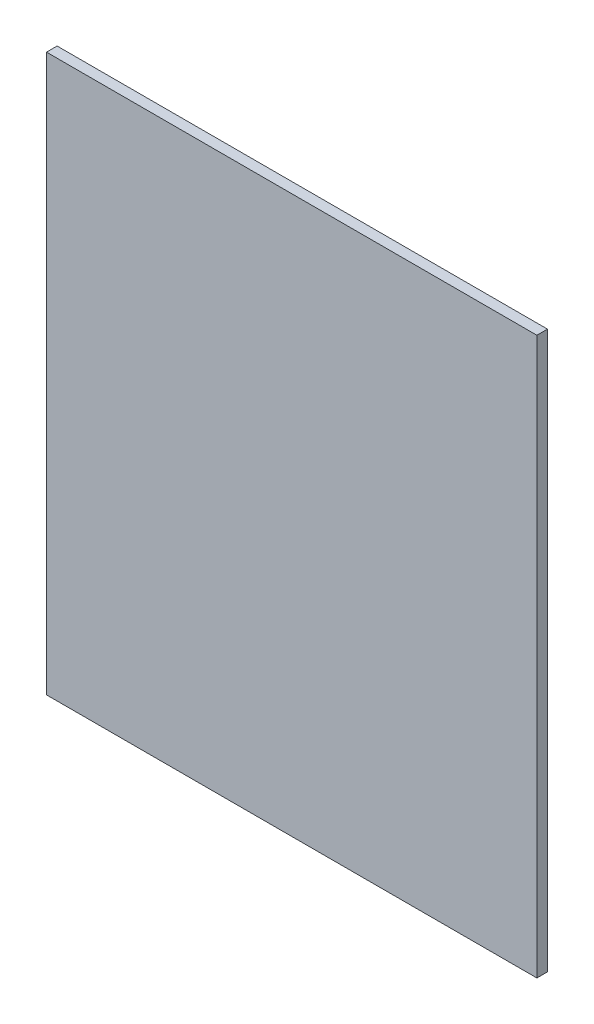
ISO-10303-21;
HEADER;
FILE_DESCRIPTION(('STEP AP214'),'2;1');
FILE_NAME('part.step','',(''),(''),'','','');
FILE_SCHEMA(('AUTOMOTIVE_DESIGN { 1 0 10303 214 1 1 1 1 }'));
ENDSEC;
DATA;
#1=APPLICATION_CONTEXT('core data for automotive mechanical design processes');
#2=APPLICATION_PROTOCOL_DEFINITION('international standard','automotive_design',2000,#1);
#3=PRODUCT_CONTEXT('',#1,'mechanical');
#4=PRODUCT('Part','Part','',(#3));
#5=PRODUCT_RELATED_PRODUCT_CATEGORY('part','',(#4));
#6=PRODUCT_DEFINITION_FORMATION('','',#4);
#7=PRODUCT_DEFINITION_CONTEXT('part definition',#1,'design');
#8=PRODUCT_DEFINITION('design','',#6,#7);
#9=PRODUCT_DEFINITION_SHAPE('','',#8);
#10=(LENGTH_UNIT() NAMED_UNIT(*) SI_UNIT(.MILLI.,.METRE.));
#11=(NAMED_UNIT(*) PLANE_ANGLE_UNIT() SI_UNIT($,.RADIAN.));
#12=(NAMED_UNIT(*) SI_UNIT($,.STERADIAN.) SOLID_ANGLE_UNIT());
#13=UNCERTAINTY_MEASURE_WITH_UNIT(LENGTH_MEASURE(1.E-05),#10,'distance_accuracy_value','');
#14=(GEOMETRIC_REPRESENTATION_CONTEXT(3) GLOBAL_UNCERTAINTY_ASSIGNED_CONTEXT((#13)) GLOBAL_UNIT_ASSIGNED_CONTEXT((#10,
#11,#12)) REPRESENTATION_CONTEXT('',''));
#15=CARTESIAN_POINT('',(0.,0.,0.));
#16=DIRECTION('',(0.,0.,1.));
#17=DIRECTION('',(1.,0.,0.));
#18=AXIS2_PLACEMENT_3D('',#15,#16,#17);
#19=CARTESIAN_POINT('',(46.25,52.5,2.));
#20=DIRECTION('',(-1.,0.,0.));
#21=DIRECTION('',(0.,0.,1.));
#22=AXIS2_PLACEMENT_3D('',#19,#20,#21);
#23=PLANE('',#22);
#24=DIRECTION('',(0.,1.,0.));
#25=VECTOR('',#24,1.);
#26=CARTESIAN_POINT('',(46.25,52.5,0.));
#27=LINE('',#26,#25);
#28=CARTESIAN_POINT('',(46.25,-52.5,0.));
#29=VERTEX_POINT('',#28);
#30=CARTESIAN_POINT('',(46.25,52.5,0.));
#31=VERTEX_POINT('',#30);
#32=EDGE_CURVE('E96',#29,#31,#27,.T.);
#33=ORIENTED_EDGE('',*,*,#32,.T.);
#34=DIRECTION('',(0.,0.,-1.));
#35=VECTOR('',#34,1.);
#36=CARTESIAN_POINT('',(46.25,52.5,2.));
#37=LINE('',#36,#35);
#38=CARTESIAN_POINT('',(46.25,52.5,2.));
#39=VERTEX_POINT('',#38);
#40=EDGE_CURVE('E11',#39,#31,#37,.T.);
#41=ORIENTED_EDGE('',*,*,#40,.F.);
#42=DIRECTION('',(0.,1.,0.));
#43=VECTOR('',#42,1.);
#44=CARTESIAN_POINT('',(46.25,52.5,2.));
#45=LINE('',#44,#43);
#46=CARTESIAN_POINT('',(46.25,-52.5,2.));
#47=VERTEX_POINT('',#46);
#48=EDGE_CURVE('E84',#47,#39,#45,.T.);
#49=ORIENTED_EDGE('',*,*,#48,.F.);
#50=DIRECTION('',(0.,0.,-1.));
#51=VECTOR('',#50,1.);
#52=CARTESIAN_POINT('',(46.25,-52.5,2.));
#53=LINE('',#52,#51);
#54=EDGE_CURVE('E92',#47,#29,#53,.T.);
#55=ORIENTED_EDGE('',*,*,#54,.T.);
#56=EDGE_LOOP('',(#33,#41,#49,#55));
#57=FACE_BOUND('',#56,.T.);
#58=ADVANCED_FACE('F33',(#57),#23,.F.);
#59=CARTESIAN_POINT('',(-46.25,52.5,2.));
#60=DIRECTION('',(0.,-1.,0.));
#61=DIRECTION('',(0.,0.,-1.));
#62=AXIS2_PLACEMENT_3D('',#59,#60,#61);
#63=PLANE('',#62);
#64=DIRECTION('',(-1.,0.,0.));
#65=VECTOR('',#64,1.);
#66=CARTESIAN_POINT('',(-46.25,52.5,0.));
#67=LINE('',#66,#65);
#68=CARTESIAN_POINT('',(-46.25,52.5,0.));
#69=VERTEX_POINT('',#68);
#70=EDGE_CURVE('E88',#31,#69,#67,.T.);
#71=ORIENTED_EDGE('',*,*,#70,.T.);
#72=DIRECTION('',(0.,0.,-1.));
#73=VECTOR('',#72,1.);
#74=CARTESIAN_POINT('',(-46.25,52.5,2.));
#75=LINE('',#74,#73);
#76=CARTESIAN_POINT('',(-46.25,52.5,2.));
#77=VERTEX_POINT('',#76);
#78=EDGE_CURVE('E41',#77,#69,#75,.T.);
#79=ORIENTED_EDGE('',*,*,#78,.F.);
#80=DIRECTION('',(-1.,0.,0.));
#81=VECTOR('',#80,1.);
#82=CARTESIAN_POINT('',(-46.25,52.5,2.));
#83=LINE('',#82,#81);
#84=EDGE_CURVE('E79',#39,#77,#83,.T.);
#85=ORIENTED_EDGE('',*,*,#84,.F.);
#86=ORIENTED_EDGE('',*,*,#40,.T.);
#87=EDGE_LOOP('',(#71,#79,#85,#86));
#88=FACE_BOUND('',#87,.T.);
#89=ADVANCED_FACE('F87',(#88),#63,.F.);
#90=CARTESIAN_POINT('',(-46.25,52.5,2.));
#91=DIRECTION('',(1.,0.,0.));
#92=DIRECTION('',(0.,1.,0.));
#93=AXIS2_PLACEMENT_3D('',#90,#91,#92);
#94=PLANE('',#93);
#95=DIRECTION('',(0.,-1.,0.));
#96=VECTOR('',#95,1.);
#97=CARTESIAN_POINT('',(-46.25,52.5,0.));
#98=LINE('',#97,#96);
#99=CARTESIAN_POINT('',(-46.25,-52.5,0.));
#100=VERTEX_POINT('',#99);
#101=EDGE_CURVE('E66',#69,#100,#98,.T.);
#102=ORIENTED_EDGE('',*,*,#101,.T.);
#103=DIRECTION('',(0.,0.,-1.));
#104=VECTOR('',#103,1.);
#105=CARTESIAN_POINT('',(-46.25,-52.5,2.));
#106=LINE('',#105,#104);
#107=CARTESIAN_POINT('',(-46.25,-52.5,2.));
#108=VERTEX_POINT('',#107);
#109=EDGE_CURVE('E89',#108,#100,#106,.T.);
#110=ORIENTED_EDGE('',*,*,#109,.F.);
#111=DIRECTION('',(0.,-1.,0.));
#112=VECTOR('',#111,1.);
#113=CARTESIAN_POINT('',(-46.25,52.5,2.));
#114=LINE('',#113,#112);
#115=EDGE_CURVE('E82',#77,#108,#114,.T.);
#116=ORIENTED_EDGE('',*,*,#115,.F.);
#117=ORIENTED_EDGE('',*,*,#78,.T.);
#118=EDGE_LOOP('',(#102,#110,#116,#117));
#119=FACE_BOUND('',#118,.T.);
#120=ADVANCED_FACE('F90',(#119),#94,.F.);
#121=CARTESIAN_POINT('',(-46.25,-52.5,2.));
#122=DIRECTION('',(0.,1.,0.));
#123=DIRECTION('',(0.,0.,1.));
#124=AXIS2_PLACEMENT_3D('',#121,#122,#123);
#125=PLANE('',#124);
#126=DIRECTION('',(1.,0.,0.));
#127=VECTOR('',#126,1.);
#128=CARTESIAN_POINT('',(-46.25,-52.5,0.));
#129=LINE('',#128,#127);
#130=EDGE_CURVE('E72',#100,#29,#129,.T.);
#131=ORIENTED_EDGE('',*,*,#130,.T.);
#132=ORIENTED_EDGE('',*,*,#54,.F.);
#133=DIRECTION('',(1.,0.,0.));
#134=VECTOR('',#133,1.);
#135=CARTESIAN_POINT('',(-46.25,-52.5,2.));
#136=LINE('',#135,#134);
#137=EDGE_CURVE('E49',#108,#47,#136,.T.);
#138=ORIENTED_EDGE('',*,*,#137,.F.);
#139=ORIENTED_EDGE('',*,*,#109,.T.);
#140=EDGE_LOOP('',(#131,#132,#138,#139));
#141=FACE_BOUND('',#140,.T.);
#142=ADVANCED_FACE('F103',(#141),#125,.F.);
#143=CARTESIAN_POINT('',(0.,0.,2.));
#144=DIRECTION('',(0.,0.,1.));
#145=DIRECTION('',(1.,0.,0.));
#146=AXIS2_PLACEMENT_3D('',#143,#144,#145);
#147=PLANE('',#146);
#148=ORIENTED_EDGE('',*,*,#48,.T.);
#149=ORIENTED_EDGE('',*,*,#84,.T.);
#150=ORIENTED_EDGE('',*,*,#115,.T.);
#151=ORIENTED_EDGE('',*,*,#137,.T.);
#152=EDGE_LOOP('',(#148,#149,#150,#151));
#153=FACE_BOUND('',#152,.T.);
#154=ADVANCED_FACE('F80',(#153),#147,.T.);
#155=CARTESIAN_POINT('',(0.,0.,0.));
#156=DIRECTION('',(0.,0.,1.));
#157=DIRECTION('',(1.,0.,0.));
#158=AXIS2_PLACEMENT_3D('',#155,#156,#157);
#159=PLANE('',#158);
#160=ORIENTED_EDGE('',*,*,#32,.F.);
#161=ORIENTED_EDGE('',*,*,#130,.F.);
#162=ORIENTED_EDGE('',*,*,#101,.F.);
#163=ORIENTED_EDGE('',*,*,#70,.F.);
#164=EDGE_LOOP('',(#160,#161,#162,#163));
#165=FACE_BOUND('',#164,.T.);
#166=ADVANCED_FACE('F106',(#165),#159,.F.);
#167=CLOSED_SHELL('',(#58,#89,#120,#142,#154,#166));
#168=MANIFOLD_SOLID_BREP('B2',#167);
#169=ADVANCED_BREP_SHAPE_REPRESENTATION('',(#18,#168),#14);
#170=SHAPE_DEFINITION_REPRESENTATION(#9,#169);
ENDSEC;
END-ISO-10303-21;
